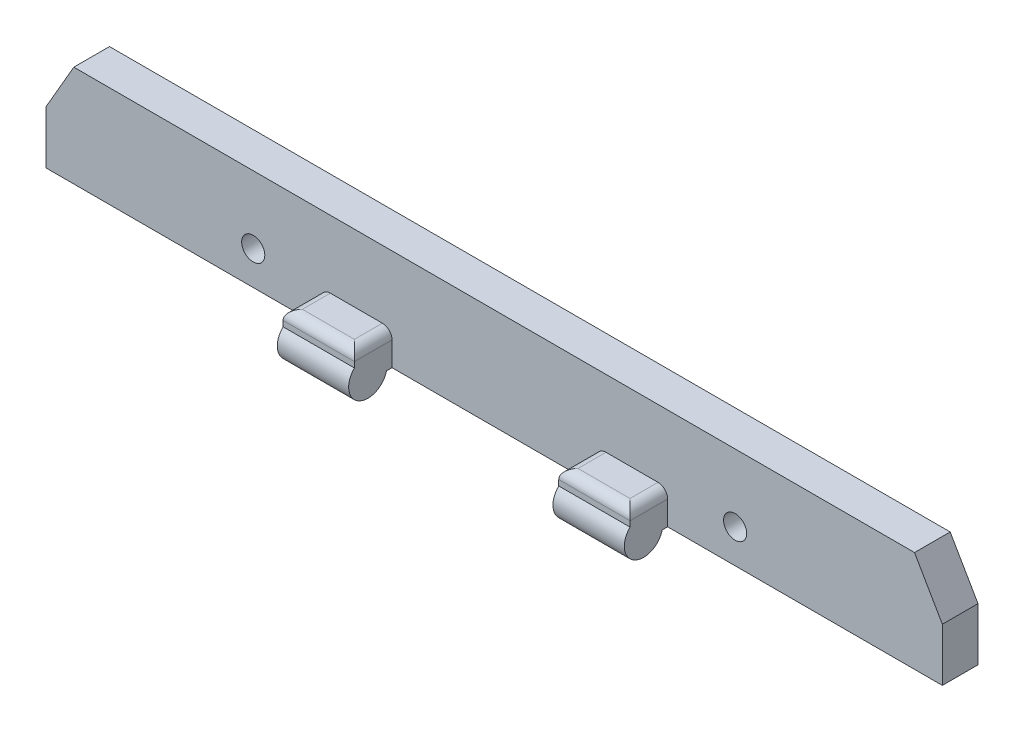
ISO-10303-21;
HEADER;
FILE_DESCRIPTION(('STEP AP214'),'2;1');
FILE_NAME('part.step','',(''),(''),'','','');
FILE_SCHEMA(('AUTOMOTIVE_DESIGN { 1 0 10303 214 1 1 1 1 }'));
ENDSEC;
DATA;
#1=APPLICATION_CONTEXT('core data for automotive mechanical design processes');
#2=APPLICATION_PROTOCOL_DEFINITION('international standard','automotive_design',2000,#1);
#3=PRODUCT_CONTEXT('',#1,'mechanical');
#4=PRODUCT('Part','Part','',(#3));
#5=PRODUCT_RELATED_PRODUCT_CATEGORY('part','',(#4));
#6=PRODUCT_DEFINITION_FORMATION('','',#4);
#7=PRODUCT_DEFINITION_CONTEXT('part definition',#1,'design');
#8=PRODUCT_DEFINITION('design','',#6,#7);
#9=PRODUCT_DEFINITION_SHAPE('','',#8);
#10=(LENGTH_UNIT() NAMED_UNIT(*) SI_UNIT(.MILLI.,.METRE.));
#11=(NAMED_UNIT(*) PLANE_ANGLE_UNIT() SI_UNIT($,.RADIAN.));
#12=(NAMED_UNIT(*) SI_UNIT($,.STERADIAN.) SOLID_ANGLE_UNIT());
#13=UNCERTAINTY_MEASURE_WITH_UNIT(LENGTH_MEASURE(1.E-05),#10,'distance_accuracy_value','');
#14=(GEOMETRIC_REPRESENTATION_CONTEXT(3) GLOBAL_UNCERTAINTY_ASSIGNED_CONTEXT((#13)) GLOBAL_UNIT_ASSIGNED_CONTEXT((#10,
#11,#12)) REPRESENTATION_CONTEXT('',''));
#15=CARTESIAN_POINT('',(0.,0.,0.));
#16=DIRECTION('',(0.,0.,1.));
#17=DIRECTION('',(1.,0.,0.));
#18=AXIS2_PLACEMENT_3D('',#15,#16,#17);
#19=CARTESIAN_POINT('',(46.5,-3.50000000000001,3.7));
#20=DIRECTION('',(0.,1.,0.));
#21=DIRECTION('',(-1.,0.,0.));
#22=AXIS2_PLACEMENT_3D('',#19,#20,#21);
#23=PLANE('',#22);
#24=DIRECTION('',(0.,0.,-1.));
#25=VECTOR('',#24,1.);
#26=CARTESIAN_POINT('',(18.,-3.49999999999999,8.7));
#27=LINE('',#26,#25);
#28=CARTESIAN_POINT('',(18.,-3.49999999999999,4.26350832689629));
#29=VERTEX_POINT('',#28);
#30=CARTESIAN_POINT('',(18.,-3.49999999999999,3.7));
#31=VERTEX_POINT('',#30);
#32=EDGE_CURVE('E252',#29,#31,#27,.T.);
#33=ORIENTED_EDGE('',*,*,#32,.F.);
#34=DIRECTION('',(1.,0.,0.));
#35=VECTOR('',#34,1.);
#36=CARTESIAN_POINT('',(6.44668806854096,-3.49999999999999,4.26350832689629));
#37=LINE('',#36,#35);
#38=CARTESIAN_POINT('',(10.6,-3.49999999999999,4.26350832689629));
#39=VERTEX_POINT('',#38);
#40=EDGE_CURVE('E177',#39,#29,#37,.T.);
#41=ORIENTED_EDGE('',*,*,#40,.F.);
#42=DIRECTION('',(0.,0.,-1.));
#43=VECTOR('',#42,1.);
#44=CARTESIAN_POINT('',(10.6,-3.49999999999999,8.7));
#45=LINE('',#44,#43);
#46=CARTESIAN_POINT('',(10.6,-3.50000000000001,3.7));
#47=VERTEX_POINT('',#46);
#48=EDGE_CURVE('E254',#39,#47,#45,.T.);
#49=ORIENTED_EDGE('',*,*,#48,.T.);
#50=DIRECTION('',(1.,0.,0.));
#51=VECTOR('',#50,1.);
#52=CARTESIAN_POINT('',(46.5,-3.50000000000001,3.7));
#53=LINE('',#52,#51);
#54=CARTESIAN_POINT('',(-10.6,-3.50000000000001,3.7));
#55=VERTEX_POINT('',#54);
#56=EDGE_CURVE('E290',#55,#47,#53,.T.);
#57=ORIENTED_EDGE('',*,*,#56,.F.);
#58=DIRECTION('',(0.,0.,-1.));
#59=VECTOR('',#58,1.);
#60=CARTESIAN_POINT('',(-10.6,-3.5,8.7));
#61=LINE('',#60,#59);
#62=CARTESIAN_POINT('',(-10.6,-3.5,4.26350832689629));
#63=VERTEX_POINT('',#62);
#64=EDGE_CURVE('E264',#63,#55,#61,.T.);
#65=ORIENTED_EDGE('',*,*,#64,.F.);
#66=DIRECTION('',(-1.,0.,0.));
#67=VECTOR('',#66,1.);
#68=CARTESIAN_POINT('',(-6.44668806854096,-3.5,4.26350832689629));
#69=LINE('',#68,#67);
#70=CARTESIAN_POINT('',(-18.,-3.5,4.26350832689629));
#71=VERTEX_POINT('',#70);
#72=EDGE_CURVE('E242',#63,#71,#69,.T.);
#73=ORIENTED_EDGE('',*,*,#72,.T.);
#74=DIRECTION('',(0.,0.,-1.));
#75=VECTOR('',#74,1.);
#76=CARTESIAN_POINT('',(-18.,-3.5,8.7));
#77=LINE('',#76,#75);
#78=CARTESIAN_POINT('',(-18.,-3.50000000000001,3.7));
#79=VERTEX_POINT('',#78);
#80=EDGE_CURVE('E266',#71,#79,#77,.T.);
#81=ORIENTED_EDGE('',*,*,#80,.T.);
#82=CARTESIAN_POINT('',(-46.5,-3.50000000000002,3.7));
#83=VERTEX_POINT('',#82);
#84=EDGE_CURVE('E286',#83,#79,#53,.T.);
#85=ORIENTED_EDGE('',*,*,#84,.F.);
#86=DIRECTION('',(0.,0.,-1.));
#87=VECTOR('',#86,1.);
#88=CARTESIAN_POINT('',(-46.5,-3.50000000000002,3.7));
#89=LINE('',#88,#87);
#90=CARTESIAN_POINT('',(-46.5,-3.50000000000002,0.));
#91=VERTEX_POINT('',#90);
#92=EDGE_CURVE('E301',#83,#91,#89,.T.);
#93=ORIENTED_EDGE('',*,*,#92,.T.);
#94=DIRECTION('',(1.,0.,0.));
#95=VECTOR('',#94,1.);
#96=CARTESIAN_POINT('',(46.5,-3.50000000000001,0.));
#97=LINE('',#96,#95);
#98=CARTESIAN_POINT('',(46.5,-3.50000000000001,0.));
#99=VERTEX_POINT('',#98);
#100=EDGE_CURVE('E295',#91,#99,#97,.T.);
#101=ORIENTED_EDGE('',*,*,#100,.T.);
#102=DIRECTION('',(0.,0.,-1.));
#103=VECTOR('',#102,1.);
#104=CARTESIAN_POINT('',(46.5,-3.50000000000001,3.7));
#105=LINE('',#104,#103);
#106=CARTESIAN_POINT('',(46.5,-3.50000000000001,3.7));
#107=VERTEX_POINT('',#106);
#108=EDGE_CURVE('E293',#107,#99,#105,.T.);
#109=ORIENTED_EDGE('',*,*,#108,.F.);
#110=EDGE_CURVE('E284',#31,#107,#53,.T.);
#111=ORIENTED_EDGE('',*,*,#110,.F.);
#112=EDGE_LOOP('',(#33,#41,#49,#57,#65,#73,#81,#85,#93,#101,#109,#111));
#113=FACE_BOUND('',#112,.T.);
#114=ADVANCED_FACE('F33',(#113),#23,.F.);
#115=CARTESIAN_POINT('',(0.,0.,3.7));
#116=DIRECTION('',(0.,0.,1.));
#117=DIRECTION('',(1.,0.,0.));
#118=AXIS2_PLACEMENT_3D('',#115,#116,#117);
#119=PLANE('',#118);
#120=DIRECTION('',(0.499999999999996,0.866025403784441,0.));
#121=VECTOR('',#120,1.);
#122=CARTESIAN_POINT('',(-46.5,1.99999999999998,3.7));
#123=LINE('',#122,#121);
#124=CARTESIAN_POINT('',(-46.5,1.99999999999998,3.7));
#125=VERTEX_POINT('',#124);
#126=CARTESIAN_POINT('',(-43.6132486540519,6.99999999999997,3.7));
#127=VERTEX_POINT('',#126);
#128=EDGE_CURVE('E224',#125,#127,#123,.T.);
#129=ORIENTED_EDGE('',*,*,#128,.F.);
#130=DIRECTION('',(0.,-1.,0.));
#131=VECTOR('',#130,1.);
#132=CARTESIAN_POINT('',(-46.5,-3.50000000000002,3.7));
#133=LINE('',#132,#131);
#134=EDGE_CURVE('E282',#125,#83,#133,.T.);
#135=ORIENTED_EDGE('',*,*,#134,.T.);
#136=ORIENTED_EDGE('',*,*,#84,.T.);
#137=DIRECTION('',(0.,-1.,0.));
#138=VECTOR('',#137,1.);
#139=CARTESIAN_POINT('',(-18.,-3.5,3.7));
#140=LINE('',#139,#138);
#141=CARTESIAN_POINT('',(-18.,-1.,3.7));
#142=VERTEX_POINT('',#141);
#143=EDGE_CURVE('E257',#142,#79,#140,.T.);
#144=ORIENTED_EDGE('',*,*,#143,.F.);
#145=CARTESIAN_POINT('',(-17.,-1.,3.7));
#146=DIRECTION('',(0.,0.,1.));
#147=DIRECTION('',(1.,0.,0.));
#148=AXIS2_PLACEMENT_3D('',#145,#146,#147);
#149=CIRCLE('',#148,1.);
#150=CARTESIAN_POINT('',(-17.,0.,3.7));
#151=VERTEX_POINT('',#150);
#152=EDGE_CURVE('E328',#142,#151,#149,.F.);
#153=ORIENTED_EDGE('',*,*,#152,.T.);
#154=DIRECTION('',(-1.,0.,0.));
#155=VECTOR('',#154,1.);
#156=CARTESIAN_POINT('',(-10.6,0.,3.7));
#157=LINE('',#156,#155);
#158=CARTESIAN_POINT('',(-11.6,0.,3.7));
#159=VERTEX_POINT('',#158);
#160=EDGE_CURVE('E261',#159,#151,#157,.T.);
#161=ORIENTED_EDGE('',*,*,#160,.F.);
#162=CARTESIAN_POINT('',(-11.6,-1.,3.7));
#163=DIRECTION('',(0.,0.,1.));
#164=DIRECTION('',(1.,0.,0.));
#165=AXIS2_PLACEMENT_3D('',#162,#163,#164);
#166=CIRCLE('',#165,1.);
#167=CARTESIAN_POINT('',(-10.6,-1.,3.7));
#168=VERTEX_POINT('',#167);
#169=EDGE_CURVE('E11',#159,#168,#166,.F.);
#170=ORIENTED_EDGE('',*,*,#169,.T.);
#171=DIRECTION('',(0.,1.,0.));
#172=VECTOR('',#171,1.);
#173=CARTESIAN_POINT('',(-10.6,-3.5,3.7));
#174=LINE('',#173,#172);
#175=EDGE_CURVE('E259',#55,#168,#174,.T.);
#176=ORIENTED_EDGE('',*,*,#175,.F.);
#177=ORIENTED_EDGE('',*,*,#56,.T.);
#178=DIRECTION('',(0.,-1.,0.));
#179=VECTOR('',#178,1.);
#180=CARTESIAN_POINT('',(10.6,-3.49999999999999,3.7));
#181=LINE('',#180,#179);
#182=CARTESIAN_POINT('',(10.6,-1.,3.7));
#183=VERTEX_POINT('',#182);
#184=EDGE_CURVE('E241',#183,#47,#181,.T.);
#185=ORIENTED_EDGE('',*,*,#184,.F.);
#186=CARTESIAN_POINT('',(11.6,-1.,3.7));
#187=DIRECTION('',(0.,0.,1.));
#188=DIRECTION('',(1.,0.,0.));
#189=AXIS2_PLACEMENT_3D('',#186,#187,#188);
#190=CIRCLE('',#189,1.);
#191=CARTESIAN_POINT('',(11.6,0.,3.7));
#192=VERTEX_POINT('',#191);
#193=EDGE_CURVE('E330',#183,#192,#190,.F.);
#194=ORIENTED_EDGE('',*,*,#193,.T.);
#195=DIRECTION('',(-1.,0.,0.));
#196=VECTOR('',#195,1.);
#197=CARTESIAN_POINT('',(18.,0.,3.7));
#198=LINE('',#197,#196);
#199=CARTESIAN_POINT('',(17.,0.,3.7));
#200=VERTEX_POINT('',#199);
#201=EDGE_CURVE('E249',#200,#192,#198,.T.);
#202=ORIENTED_EDGE('',*,*,#201,.F.);
#203=CARTESIAN_POINT('',(17.,-1.,3.7));
#204=DIRECTION('',(0.,0.,1.));
#205=DIRECTION('',(1.,0.,0.));
#206=AXIS2_PLACEMENT_3D('',#203,#204,#205);
#207=CIRCLE('',#206,1.);
#208=CARTESIAN_POINT('',(18.,-1.,3.7));
#209=VERTEX_POINT('',#208);
#210=EDGE_CURVE('E42',#200,#209,#207,.F.);
#211=ORIENTED_EDGE('',*,*,#210,.T.);
#212=DIRECTION('',(0.,1.,0.));
#213=VECTOR('',#212,1.);
#214=CARTESIAN_POINT('',(18.,-3.49999999999999,3.7));
#215=LINE('',#214,#213);
#216=EDGE_CURVE('E247',#31,#209,#215,.T.);
#217=ORIENTED_EDGE('',*,*,#216,.F.);
#218=ORIENTED_EDGE('',*,*,#110,.T.);
#219=DIRECTION('',(0.,1.,0.));
#220=VECTOR('',#219,1.);
#221=CARTESIAN_POINT('',(46.5,-3.50000000000001,3.7));
#222=LINE('',#221,#220);
#223=CARTESIAN_POINT('',(46.5,2.00000000000054,3.7));
#224=VERTEX_POINT('',#223);
#225=EDGE_CURVE('E289',#107,#224,#222,.T.);
#226=ORIENTED_EDGE('',*,*,#225,.T.);
#227=DIRECTION('',(0.500000000000116,-0.866025403784372,0.));
#228=VECTOR('',#227,1.);
#229=CARTESIAN_POINT('',(46.5,2.00000000000054,3.7));
#230=LINE('',#229,#228);
#231=CARTESIAN_POINT('',(43.6132486540519,6.99999999999998,3.7));
#232=VERTEX_POINT('',#231);
#233=EDGE_CURVE('E213',#232,#224,#230,.T.);
#234=ORIENTED_EDGE('',*,*,#233,.F.);
#235=DIRECTION('',(-1.,0.,0.));
#236=VECTOR('',#235,1.);
#237=CARTESIAN_POINT('',(43.6132486540519,6.99999999999998,3.7));
#238=LINE('',#237,#236);
#239=EDGE_CURVE('E209',#232,#127,#238,.T.);
#240=ORIENTED_EDGE('',*,*,#239,.T.);
#241=EDGE_LOOP('',(#129,#135,#136,#144,#153,#161,#170,#176,#177,#185,#194,#202,#211,#217,#218,
#226,#234,#240));
#242=FACE_BOUND('',#241,.T.);
#243=CARTESIAN_POINT('',(-25.,0.,3.7));
#244=DIRECTION('',(0.,0.,1.));
#245=DIRECTION('',(1.,0.,0.));
#246=AXIS2_PLACEMENT_3D('',#243,#244,#245);
#247=CIRCLE('',#246,1.2);
#248=CARTESIAN_POINT('',(-23.8,0.,3.7));
#249=VERTEX_POINT('',#248);
#250=EDGE_CURVE('E276',#249,#249,#247,.T.);
#251=ORIENTED_EDGE('',*,*,#250,.F.);
#252=EDGE_LOOP('',(#251));
#253=FACE_BOUND('',#252,.T.);
#254=CARTESIAN_POINT('',(25.,0.,3.7));
#255=DIRECTION('',(0.,0.,1.));
#256=DIRECTION('',(1.,0.,0.));
#257=AXIS2_PLACEMENT_3D('',#254,#255,#256);
#258=CIRCLE('',#257,1.2);
#259=CARTESIAN_POINT('',(26.2,0.,3.7));
#260=VERTEX_POINT('',#259);
#261=EDGE_CURVE('E270',#260,#260,#258,.T.);
#262=ORIENTED_EDGE('',*,*,#261,.F.);
#263=EDGE_LOOP('',(#262));
#264=FACE_BOUND('',#263,.T.);
#265=ADVANCED_FACE('F352',(#242,#253,#264),#119,.T.);
#266=CARTESIAN_POINT('',(0.,0.,0.));
#267=DIRECTION('',(0.,0.,1.));
#268=DIRECTION('',(1.,0.,0.));
#269=AXIS2_PLACEMENT_3D('',#266,#267,#268);
#270=PLANE('',#269);
#271=DIRECTION('',(0.,-1.,0.));
#272=VECTOR('',#271,1.);
#273=CARTESIAN_POINT('',(-46.5,-3.50000000000002,0.));
#274=LINE('',#273,#272);
#275=CARTESIAN_POINT('',(-46.5,1.99999999999998,0.));
#276=VERTEX_POINT('',#275);
#277=EDGE_CURVE('E279',#276,#91,#274,.T.);
#278=ORIENTED_EDGE('',*,*,#277,.F.);
#279=DIRECTION('',(0.499999999999996,0.866025403784441,0.));
#280=VECTOR('',#279,1.);
#281=CARTESIAN_POINT('',(-46.5,1.99999999999998,0.));
#282=LINE('',#281,#280);
#283=CARTESIAN_POINT('',(-43.6132486540519,6.99999999999997,0.));
#284=VERTEX_POINT('',#283);
#285=EDGE_CURVE('E222',#276,#284,#282,.T.);
#286=ORIENTED_EDGE('',*,*,#285,.T.);
#287=DIRECTION('',(1.,0.,0.));
#288=VECTOR('',#287,1.);
#289=CARTESIAN_POINT('',(43.6132486540519,6.99999999999998,0.));
#290=LINE('',#289,#288);
#291=CARTESIAN_POINT('',(43.6132486540519,6.99999999999998,0.));
#292=VERTEX_POINT('',#291);
#293=EDGE_CURVE('E210',#284,#292,#290,.T.);
#294=ORIENTED_EDGE('',*,*,#293,.T.);
#295=DIRECTION('',(0.500000000000116,-0.866025403784372,0.));
#296=VECTOR('',#295,1.);
#297=CARTESIAN_POINT('',(46.5,2.00000000000054,0.));
#298=LINE('',#297,#296);
#299=CARTESIAN_POINT('',(46.5,2.00000000000054,0.));
#300=VERTEX_POINT('',#299);
#301=EDGE_CURVE('E228',#292,#300,#298,.T.);
#302=ORIENTED_EDGE('',*,*,#301,.T.);
#303=DIRECTION('',(0.,1.,0.));
#304=VECTOR('',#303,1.);
#305=CARTESIAN_POINT('',(46.5,-3.50000000000001,0.));
#306=LINE('',#305,#304);
#307=EDGE_CURVE('E285',#99,#300,#306,.T.);
#308=ORIENTED_EDGE('',*,*,#307,.F.);
#309=ORIENTED_EDGE('',*,*,#100,.F.);
#310=EDGE_LOOP('',(#278,#286,#294,#302,#308,#309));
#311=FACE_BOUND('',#310,.T.);
#312=CARTESIAN_POINT('',(-25.,0.,0.));
#313=DIRECTION('',(0.,0.,1.));
#314=DIRECTION('',(1.,0.,0.));
#315=AXIS2_PLACEMENT_3D('',#312,#313,#314);
#316=CIRCLE('',#315,1.2);
#317=CARTESIAN_POINT('',(-23.8,0.,0.));
#318=VERTEX_POINT('',#317);
#319=EDGE_CURVE('E273',#318,#318,#316,.T.);
#320=ORIENTED_EDGE('',*,*,#319,.T.);
#321=EDGE_LOOP('',(#320));
#322=FACE_BOUND('',#321,.T.);
#323=CARTESIAN_POINT('',(25.,0.,0.));
#324=DIRECTION('',(0.,0.,1.));
#325=DIRECTION('',(1.,0.,0.));
#326=AXIS2_PLACEMENT_3D('',#323,#324,#325);
#327=CIRCLE('',#326,1.2);
#328=CARTESIAN_POINT('',(26.2,0.,0.));
#329=VERTEX_POINT('',#328);
#330=EDGE_CURVE('E269',#329,#329,#327,.T.);
#331=ORIENTED_EDGE('',*,*,#330,.T.);
#332=EDGE_LOOP('',(#331));
#333=FACE_BOUND('',#332,.T.);
#334=ADVANCED_FACE('F374',(#311,#322,#333),#270,.F.);
#335=CARTESIAN_POINT('',(-46.5,-3.50000000000002,3.7));
#336=DIRECTION('',(1.,0.,0.));
#337=DIRECTION('',(0.,0.,-1.));
#338=AXIS2_PLACEMENT_3D('',#335,#336,#337);
#339=PLANE('',#338);
#340=ORIENTED_EDGE('',*,*,#134,.F.);
#341=DIRECTION('',(0.,0.,1.));
#342=VECTOR('',#341,1.);
#343=CARTESIAN_POINT('',(-46.5,1.99999999999998,0.));
#344=LINE('',#343,#342);
#345=EDGE_CURVE('E181',#276,#125,#344,.T.);
#346=ORIENTED_EDGE('',*,*,#345,.F.);
#347=ORIENTED_EDGE('',*,*,#277,.T.);
#348=ORIENTED_EDGE('',*,*,#92,.F.);
#349=EDGE_LOOP('',(#340,#346,#347,#348));
#350=FACE_BOUND('',#349,.T.);
#351=ADVANCED_FACE('F388',(#350),#339,.F.);
#352=CARTESIAN_POINT('',(46.5,-3.50000000000001,3.7));
#353=DIRECTION('',(-1.,0.,0.));
#354=DIRECTION('',(0.,0.,1.));
#355=AXIS2_PLACEMENT_3D('',#352,#353,#354);
#356=PLANE('',#355);
#357=ORIENTED_EDGE('',*,*,#307,.T.);
#358=DIRECTION('',(0.,0.,1.));
#359=VECTOR('',#358,1.);
#360=CARTESIAN_POINT('',(46.5,2.00000000000054,0.));
#361=LINE('',#360,#359);
#362=EDGE_CURVE('E226',#300,#224,#361,.T.);
#363=ORIENTED_EDGE('',*,*,#362,.T.);
#364=ORIENTED_EDGE('',*,*,#225,.F.);
#365=ORIENTED_EDGE('',*,*,#108,.T.);
#366=EDGE_LOOP('',(#357,#363,#364,#365));
#367=FACE_BOUND('',#366,.T.);
#368=ADVANCED_FACE('F369',(#367),#356,.F.);
#369=CARTESIAN_POINT('',(-25.,0.,3.7));
#370=DIRECTION('',(0.,0.,-1.));
#371=DIRECTION('',(-1.,0.,0.));
#372=AXIS2_PLACEMENT_3D('',#369,#370,#371);
#373=CYLINDRICAL_SURFACE('',#372,1.2);
#374=ORIENTED_EDGE('',*,*,#250,.T.);
#375=EDGE_LOOP('',(#374));
#376=FACE_BOUND('',#375,.T.);
#377=ORIENTED_EDGE('',*,*,#319,.F.);
#378=EDGE_LOOP('',(#377));
#379=FACE_BOUND('',#378,.T.);
#380=ADVANCED_FACE('F606',(#376,#379),#373,.F.);
#381=CARTESIAN_POINT('',(25.,0.,3.7));
#382=DIRECTION('',(0.,0.,-1.));
#383=DIRECTION('',(-1.,0.,0.));
#384=AXIS2_PLACEMENT_3D('',#381,#382,#383);
#385=CYLINDRICAL_SURFACE('',#384,1.2);
#386=ORIENTED_EDGE('',*,*,#261,.T.);
#387=EDGE_LOOP('',(#386));
#388=FACE_BOUND('',#387,.T.);
#389=ORIENTED_EDGE('',*,*,#330,.F.);
#390=EDGE_LOOP('',(#389));
#391=FACE_BOUND('',#390,.T.);
#392=ADVANCED_FACE('F538',(#388,#391),#385,.F.);
#393=CARTESIAN_POINT('',(-18.,-3.5,8.7));
#394=DIRECTION('',(1.,0.,0.));
#395=DIRECTION('',(0.,0.,-1.));
#396=AXIS2_PLACEMENT_3D('',#393,#394,#395);
#397=PLANE('',#396);
#398=DIRECTION('',(0.,1.,0.));
#399=VECTOR('',#398,1.);
#400=CARTESIAN_POINT('',(-18.,-3.5,7.60125853844408));
#401=LINE('',#400,#399);
#402=CARTESIAN_POINT('',(-18.,-1.57294901687515,7.60125853844408));
#403=VERTEX_POINT('',#402);
#404=CARTESIAN_POINT('',(-18.,-1.,7.60125853844408));
#405=VERTEX_POINT('',#404);
#406=EDGE_CURVE('E206',#403,#405,#401,.T.);
#407=ORIENTED_EDGE('',*,*,#406,.T.);
#408=DIRECTION('',(0.,0.,-1.));
#409=VECTOR('',#408,1.);
#410=CARTESIAN_POINT('',(-18.,-1.,8.7));
#411=LINE('',#410,#409);
#412=EDGE_CURVE('E304',#405,#142,#411,.T.);
#413=ORIENTED_EDGE('',*,*,#412,.T.);
#414=ORIENTED_EDGE('',*,*,#143,.T.);
#415=ORIENTED_EDGE('',*,*,#80,.F.);
#416=CARTESIAN_POINT('',(-18.,-3.,6.2));
#417=DIRECTION('',(-1.,0.,0.));
#418=DIRECTION('',(0.,0.,1.));
#419=AXIS2_PLACEMENT_3D('',#416,#417,#418);
#420=CIRCLE('',#419,2.);
#421=EDGE_CURVE('E235',#71,#403,#420,.T.);
#422=ORIENTED_EDGE('',*,*,#421,.T.);
#423=EDGE_LOOP('',(#407,#413,#414,#415,#422));
#424=FACE_BOUND('',#423,.T.);
#425=ADVANCED_FACE('F392',(#424),#397,.F.);
#426=CARTESIAN_POINT('',(-10.6,-3.5,8.7));
#427=DIRECTION('',(-1.,0.,0.));
#428=DIRECTION('',(0.,0.,1.));
#429=AXIS2_PLACEMENT_3D('',#426,#427,#428);
#430=PLANE('',#429);
#431=ORIENTED_EDGE('',*,*,#175,.T.);
#432=DIRECTION('',(0.,0.,-1.));
#433=VECTOR('',#432,1.);
#434=CARTESIAN_POINT('',(-10.6,-1.,8.7));
#435=LINE('',#434,#433);
#436=CARTESIAN_POINT('',(-10.6,-1.,7.60125853844408));
#437=VERTEX_POINT('',#436);
#438=EDGE_CURVE('E55',#168,#437,#435,.F.);
#439=ORIENTED_EDGE('',*,*,#438,.T.);
#440=DIRECTION('',(0.,-1.,0.));
#441=VECTOR('',#440,1.);
#442=CARTESIAN_POINT('',(-10.6,-3.5,7.60125853844408));
#443=LINE('',#442,#441);
#444=CARTESIAN_POINT('',(-10.6,-1.57294901687515,7.60125853844408));
#445=VERTEX_POINT('',#444);
#446=EDGE_CURVE('E204',#437,#445,#443,.T.);
#447=ORIENTED_EDGE('',*,*,#446,.T.);
#448=CARTESIAN_POINT('',(-10.6,-3.,6.2));
#449=DIRECTION('',(-1.,0.,0.));
#450=DIRECTION('',(0.,0.,1.));
#451=AXIS2_PLACEMENT_3D('',#448,#449,#450);
#452=CIRCLE('',#451,2.);
#453=EDGE_CURVE('E238',#445,#63,#452,.F.);
#454=ORIENTED_EDGE('',*,*,#453,.T.);
#455=ORIENTED_EDGE('',*,*,#64,.T.);
#456=EDGE_LOOP('',(#431,#439,#447,#454,#455));
#457=FACE_BOUND('',#456,.T.);
#458=ADVANCED_FACE('F520',(#457),#430,.F.);
#459=CARTESIAN_POINT('',(-10.6,0.,8.7));
#460=DIRECTION('',(0.,-1.,0.));
#461=DIRECTION('',(1.,0.,0.));
#462=AXIS2_PLACEMENT_3D('',#459,#460,#461);
#463=PLANE('',#462);
#464=ORIENTED_EDGE('',*,*,#160,.T.);
#465=DIRECTION('',(0.,0.,-1.));
#466=VECTOR('',#465,1.);
#467=CARTESIAN_POINT('',(-17.,0.,8.7));
#468=LINE('',#467,#466);
#469=CARTESIAN_POINT('',(-17.,0.,6.60125853844408));
#470=VERTEX_POINT('',#469);
#471=EDGE_CURVE('E311',#151,#470,#468,.F.);
#472=ORIENTED_EDGE('',*,*,#471,.T.);
#473=DIRECTION('',(1.,0.,0.));
#474=VECTOR('',#473,1.);
#475=CARTESIAN_POINT('',(-10.6,0.,6.60125853844408));
#476=LINE('',#475,#474);
#477=CARTESIAN_POINT('',(-11.6,0.,6.60125853844408));
#478=VERTEX_POINT('',#477);
#479=EDGE_CURVE('E307',#470,#478,#476,.T.);
#480=ORIENTED_EDGE('',*,*,#479,.T.);
#481=DIRECTION('',(0.,0.,-1.));
#482=VECTOR('',#481,1.);
#483=CARTESIAN_POINT('',(-11.6,0.,8.7));
#484=LINE('',#483,#482);
#485=EDGE_CURVE('E309',#478,#159,#484,.T.);
#486=ORIENTED_EDGE('',*,*,#485,.T.);
#487=EDGE_LOOP('',(#464,#472,#480,#486));
#488=FACE_BOUND('',#487,.T.);
#489=ADVANCED_FACE('F401',(#488),#463,.F.);
#490=CARTESIAN_POINT('',(10.6,-3.49999999999999,8.7));
#491=DIRECTION('',(1.,0.,0.));
#492=DIRECTION('',(0.,0.,-1.));
#493=AXIS2_PLACEMENT_3D('',#490,#491,#492);
#494=PLANE('',#493);
#495=DIRECTION('',(0.,1.,0.));
#496=VECTOR('',#495,1.);
#497=CARTESIAN_POINT('',(10.6,-3.49999999999999,7.60125853844408));
#498=LINE('',#497,#496);
#499=CARTESIAN_POINT('',(10.6,-1.57294901687515,7.60125853844408));
#500=VERTEX_POINT('',#499);
#501=CARTESIAN_POINT('',(10.6,-1.,7.60125853844408));
#502=VERTEX_POINT('',#501);
#503=EDGE_CURVE('E190',#500,#502,#498,.T.);
#504=ORIENTED_EDGE('',*,*,#503,.T.);
#505=DIRECTION('',(0.,0.,-1.));
#506=VECTOR('',#505,1.);
#507=CARTESIAN_POINT('',(10.6,-1.,8.7));
#508=LINE('',#507,#506);
#509=EDGE_CURVE('E313',#502,#183,#508,.T.);
#510=ORIENTED_EDGE('',*,*,#509,.T.);
#511=ORIENTED_EDGE('',*,*,#184,.T.);
#512=ORIENTED_EDGE('',*,*,#48,.F.);
#513=CARTESIAN_POINT('',(10.6,-2.99999999999999,6.2));
#514=DIRECTION('',(1.,0.,0.));
#515=DIRECTION('',(0.,0.,-1.));
#516=AXIS2_PLACEMENT_3D('',#513,#514,#515);
#517=CIRCLE('',#516,2.);
#518=EDGE_CURVE('E234',#39,#500,#517,.F.);
#519=ORIENTED_EDGE('',*,*,#518,.T.);
#520=EDGE_LOOP('',(#504,#510,#511,#512,#519));
#521=FACE_BOUND('',#520,.T.);
#522=ADVANCED_FACE('F359',(#521),#494,.F.);
#523=CARTESIAN_POINT('',(18.,-3.49999999999999,8.7));
#524=DIRECTION('',(-1.,0.,0.));
#525=DIRECTION('',(0.,0.,1.));
#526=AXIS2_PLACEMENT_3D('',#523,#524,#525);
#527=PLANE('',#526);
#528=ORIENTED_EDGE('',*,*,#216,.T.);
#529=DIRECTION('',(0.,0.,-1.));
#530=VECTOR('',#529,1.);
#531=CARTESIAN_POINT('',(18.,-1.,8.7));
#532=LINE('',#531,#530);
#533=CARTESIAN_POINT('',(18.,-1.,7.60125853844408));
#534=VERTEX_POINT('',#533);
#535=EDGE_CURVE('E196',#209,#534,#532,.F.);
#536=ORIENTED_EDGE('',*,*,#535,.T.);
#537=DIRECTION('',(0.,1.,0.));
#538=VECTOR('',#537,1.);
#539=CARTESIAN_POINT('',(18.,-1.57294901687515,7.60125853844408));
#540=LINE('',#539,#538);
#541=CARTESIAN_POINT('',(18.,-1.57294901687515,7.60125853844408));
#542=VERTEX_POINT('',#541);
#543=EDGE_CURVE('E187',#542,#534,#540,.T.);
#544=ORIENTED_EDGE('',*,*,#543,.F.);
#545=CARTESIAN_POINT('',(18.,-2.99999999999999,6.2));
#546=DIRECTION('',(1.,0.,0.));
#547=DIRECTION('',(0.,0.,-1.));
#548=AXIS2_PLACEMENT_3D('',#545,#546,#547);
#549=CIRCLE('',#548,2.);
#550=EDGE_CURVE('E172',#542,#29,#549,.T.);
#551=ORIENTED_EDGE('',*,*,#550,.T.);
#552=ORIENTED_EDGE('',*,*,#32,.T.);
#553=EDGE_LOOP('',(#528,#536,#544,#551,#552));
#554=FACE_BOUND('',#553,.T.);
#555=ADVANCED_FACE('F194',(#554),#527,.F.);
#556=CARTESIAN_POINT('',(18.,0.,8.7));
#557=DIRECTION('',(0.,-1.,0.));
#558=DIRECTION('',(1.,0.,0.));
#559=AXIS2_PLACEMENT_3D('',#556,#557,#558);
#560=PLANE('',#559);
#561=ORIENTED_EDGE('',*,*,#201,.T.);
#562=DIRECTION('',(0.,0.,-1.));
#563=VECTOR('',#562,1.);
#564=CARTESIAN_POINT('',(11.6,0.,8.7));
#565=LINE('',#564,#563);
#566=CARTESIAN_POINT('',(11.6,0.,6.60125853844408));
#567=VERTEX_POINT('',#566);
#568=EDGE_CURVE('E320',#192,#567,#565,.F.);
#569=ORIENTED_EDGE('',*,*,#568,.T.);
#570=DIRECTION('',(1.,0.,0.));
#571=VECTOR('',#570,1.);
#572=CARTESIAN_POINT('',(18.,0.,6.60125853844408));
#573=LINE('',#572,#571);
#574=CARTESIAN_POINT('',(17.,0.,6.60125853844408));
#575=VERTEX_POINT('',#574);
#576=EDGE_CURVE('E316',#567,#575,#573,.T.);
#577=ORIENTED_EDGE('',*,*,#576,.T.);
#578=DIRECTION('',(0.,0.,-1.));
#579=VECTOR('',#578,1.);
#580=CARTESIAN_POINT('',(17.,0.,8.7));
#581=LINE('',#580,#579);
#582=EDGE_CURVE('E318',#575,#200,#581,.T.);
#583=ORIENTED_EDGE('',*,*,#582,.T.);
#584=EDGE_LOOP('',(#561,#569,#577,#583));
#585=FACE_BOUND('',#584,.T.);
#586=ADVANCED_FACE('F350',(#585),#560,.F.);
#587=CARTESIAN_POINT('',(-6.44668806854096,-3.,6.2));
#588=DIRECTION('',(-1.,0.,0.));
#589=DIRECTION('',(0.,0.,1.));
#590=AXIS2_PLACEMENT_3D('',#587,#588,#589);
#591=CYLINDRICAL_SURFACE('',#590,2.);
#592=ORIENTED_EDGE('',*,*,#453,.F.);
#593=DIRECTION('',(1.,0.,0.));
#594=VECTOR('',#593,1.);
#595=CARTESIAN_POINT('',(-46.5,-1.57294901687515,7.60125853844408));
#596=LINE('',#595,#594);
#597=EDGE_CURVE('E191',#403,#445,#596,.T.);
#598=ORIENTED_EDGE('',*,*,#597,.F.);
#599=ORIENTED_EDGE('',*,*,#421,.F.);
#600=ORIENTED_EDGE('',*,*,#72,.F.);
#601=EDGE_LOOP('',(#592,#598,#599,#600));
#602=FACE_BOUND('',#601,.T.);
#603=ADVANCED_FACE('F489',(#602),#591,.T.);
#604=CARTESIAN_POINT('',(6.44668806854096,-2.99999999999999,6.2));
#605=DIRECTION('',(1.,0.,0.));
#606=DIRECTION('',(0.,0.,-1.));
#607=AXIS2_PLACEMENT_3D('',#604,#605,#606);
#608=CYLINDRICAL_SURFACE('',#607,2.);
#609=ORIENTED_EDGE('',*,*,#518,.F.);
#610=ORIENTED_EDGE('',*,*,#40,.T.);
#611=ORIENTED_EDGE('',*,*,#550,.F.);
#612=EDGE_CURVE('E175',#500,#542,#596,.T.);
#613=ORIENTED_EDGE('',*,*,#612,.F.);
#614=EDGE_LOOP('',(#609,#610,#611,#613));
#615=FACE_BOUND('',#614,.T.);
#616=ADVANCED_FACE('F174',(#615),#608,.T.);
#617=CARTESIAN_POINT('',(46.5,2.00000000000054,0.));
#618=DIRECTION('',(-0.866025403784372,-0.500000000000116,0.));
#619=DIRECTION('',(0.500000000000116,-0.866025403784372,0.));
#620=AXIS2_PLACEMENT_3D('',#617,#618,#619);
#621=PLANE('',#620);
#622=ORIENTED_EDGE('',*,*,#233,.T.);
#623=ORIENTED_EDGE('',*,*,#362,.F.);
#624=ORIENTED_EDGE('',*,*,#301,.F.);
#625=DIRECTION('',(0.,0.,1.));
#626=VECTOR('',#625,1.);
#627=CARTESIAN_POINT('',(43.6132486540519,6.99999999999998,-91.3350346241365));
#628=LINE('',#627,#626);
#629=EDGE_CURVE('E217',#292,#232,#628,.T.);
#630=ORIENTED_EDGE('',*,*,#629,.T.);
#631=EDGE_LOOP('',(#622,#623,#624,#630));
#632=FACE_BOUND('',#631,.T.);
#633=ADVANCED_FACE('F371',(#632),#621,.F.);
#634=CARTESIAN_POINT('',(-46.5,1.99999999999998,0.));
#635=DIRECTION('',(0.866025403784441,-0.499999999999996,0.));
#636=DIRECTION('',(0.499999999999996,0.866025403784441,0.));
#637=AXIS2_PLACEMENT_3D('',#634,#635,#636);
#638=PLANE('',#637);
#639=ORIENTED_EDGE('',*,*,#128,.T.);
#640=DIRECTION('',(0.,0.,1.));
#641=VECTOR('',#640,1.);
#642=CARTESIAN_POINT('',(-43.6132486540519,6.99999999999997,-91.3350346241365));
#643=LINE('',#642,#641);
#644=EDGE_CURVE('E214',#284,#127,#643,.T.);
#645=ORIENTED_EDGE('',*,*,#644,.F.);
#646=ORIENTED_EDGE('',*,*,#285,.F.);
#647=ORIENTED_EDGE('',*,*,#345,.T.);
#648=EDGE_LOOP('',(#639,#645,#646,#647));
#649=FACE_BOUND('',#648,.T.);
#650=ADVANCED_FACE('F575',(#649),#638,.F.);
#651=CARTESIAN_POINT('',(43.6132486540519,6.99999999999998,-91.3350346241365));
#652=DIRECTION('',(0.,1.,0.));
#653=DIRECTION('',(-1.,0.,0.));
#654=AXIS2_PLACEMENT_3D('',#651,#652,#653);
#655=PLANE('',#654);
#656=ORIENTED_EDGE('',*,*,#293,.F.);
#657=ORIENTED_EDGE('',*,*,#644,.T.);
#658=ORIENTED_EDGE('',*,*,#239,.F.);
#659=ORIENTED_EDGE('',*,*,#629,.F.);
#660=EDGE_LOOP('',(#656,#657,#658,#659));
#661=FACE_BOUND('',#660,.T.);
#662=ADVANCED_FACE('F381',(#661),#655,.T.);
#663=CARTESIAN_POINT('',(-46.5,-1.57294901687515,7.60125853844408));
#664=DIRECTION('',(0.,0.,-1.));
#665=DIRECTION('',(-1.,0.,0.));
#666=AXIS2_PLACEMENT_3D('',#663,#664,#665);
#667=PLANE('',#666);
#668=ORIENTED_EDGE('',*,*,#543,.T.);
#669=DIRECTION('',(1.,0.,0.));
#670=VECTOR('',#669,1.);
#671=CARTESIAN_POINT('',(-46.5,-1.00000000000001,7.60125853844408));
#672=LINE('',#671,#670);
#673=EDGE_CURVE('E326',#534,#502,#672,.F.);
#674=ORIENTED_EDGE('',*,*,#673,.T.);
#675=ORIENTED_EDGE('',*,*,#503,.F.);
#676=ORIENTED_EDGE('',*,*,#612,.T.);
#677=EDGE_LOOP('',(#668,#674,#675,#676));
#678=FACE_BOUND('',#677,.T.);
#679=ADVANCED_FACE('F186',(#678),#667,.F.);
#680=ORIENTED_EDGE('',*,*,#446,.F.);
#681=DIRECTION('',(1.,0.,0.));
#682=VECTOR('',#681,1.);
#683=CARTESIAN_POINT('',(-46.5,-1.,7.60125853844408));
#684=LINE('',#683,#682);
#685=EDGE_CURVE('E324',#437,#405,#684,.F.);
#686=ORIENTED_EDGE('',*,*,#685,.T.);
#687=ORIENTED_EDGE('',*,*,#406,.F.);
#688=ORIENTED_EDGE('',*,*,#597,.T.);
#689=EDGE_LOOP('',(#680,#686,#687,#688));
#690=FACE_BOUND('',#689,.T.);
#691=ADVANCED_FACE('F410',(#690),#667,.F.);
#692=CARTESIAN_POINT('',(-11.6,-1.,8.7));
#693=DIRECTION('',(0.,0.,-1.));
#694=DIRECTION('',(-1.,0.,0.));
#695=AXIS2_PLACEMENT_3D('',#692,#693,#694);
#696=CYLINDRICAL_SURFACE('',#695,1.);
#697=ORIENTED_EDGE('',*,*,#169,.F.);
#698=ORIENTED_EDGE('',*,*,#485,.F.);
#699=CARTESIAN_POINT('',(-11.6,-1.,6.60125853844408));
#700=DIRECTION('',(0.707106781186547,0.,-0.707106781186547));
#701=DIRECTION('',(0.707106781186547,0.,0.707106781186547));
#702=AXIS2_PLACEMENT_3D('',#699,#700,#701);
#703=ELLIPSE('',#702,1.41421356237309,1.);
#704=EDGE_CURVE('E197',#437,#478,#703,.F.);
#705=ORIENTED_EDGE('',*,*,#704,.F.);
#706=ORIENTED_EDGE('',*,*,#438,.F.);
#707=EDGE_LOOP('',(#697,#698,#705,#706));
#708=FACE_BOUND('',#707,.T.);
#709=ADVANCED_FACE('F408',(#708),#696,.T.);
#710=CARTESIAN_POINT('',(-10.6,-1.,6.60125853844408));
#711=DIRECTION('',(1.,0.,0.));
#712=DIRECTION('',(0.,1.,0.));
#713=AXIS2_PLACEMENT_3D('',#710,#711,#712);
#714=CYLINDRICAL_SURFACE('',#713,1.);
#715=ORIENTED_EDGE('',*,*,#704,.T.);
#716=ORIENTED_EDGE('',*,*,#479,.F.);
#717=CARTESIAN_POINT('',(-17.,-1.,6.60125853844408));
#718=DIRECTION('',(0.707106781186547,0.,0.707106781186547));
#719=DIRECTION('',(0.707106781186547,0.,-0.707106781186547));
#720=AXIS2_PLACEMENT_3D('',#717,#718,#719);
#721=ELLIPSE('',#720,1.41421356237309,1.);
#722=EDGE_CURVE('E200',#405,#470,#721,.F.);
#723=ORIENTED_EDGE('',*,*,#722,.F.);
#724=ORIENTED_EDGE('',*,*,#685,.F.);
#725=EDGE_LOOP('',(#715,#716,#723,#724));
#726=FACE_BOUND('',#725,.T.);
#727=ADVANCED_FACE('F404',(#726),#714,.T.);
#728=CARTESIAN_POINT('',(-17.,-1.,8.7));
#729=DIRECTION('',(0.,0.,-1.));
#730=DIRECTION('',(-1.,0.,0.));
#731=AXIS2_PLACEMENT_3D('',#728,#729,#730);
#732=CYLINDRICAL_SURFACE('',#731,1.);
#733=ORIENTED_EDGE('',*,*,#722,.T.);
#734=ORIENTED_EDGE('',*,*,#471,.F.);
#735=ORIENTED_EDGE('',*,*,#152,.F.);
#736=ORIENTED_EDGE('',*,*,#412,.F.);
#737=EDGE_LOOP('',(#733,#734,#735,#736));
#738=FACE_BOUND('',#737,.T.);
#739=ADVANCED_FACE('F397',(#738),#732,.T.);
#740=CARTESIAN_POINT('',(17.,-1.,8.7));
#741=DIRECTION('',(0.,0.,-1.));
#742=DIRECTION('',(-1.,0.,0.));
#743=AXIS2_PLACEMENT_3D('',#740,#741,#742);
#744=CYLINDRICAL_SURFACE('',#743,1.);
#745=ORIENTED_EDGE('',*,*,#210,.F.);
#746=ORIENTED_EDGE('',*,*,#582,.F.);
#747=CARTESIAN_POINT('',(17.,-1.,6.60125853844408));
#748=DIRECTION('',(0.707106781186547,0.,-0.707106781186547));
#749=DIRECTION('',(0.707106781186547,0.,0.707106781186547));
#750=AXIS2_PLACEMENT_3D('',#747,#748,#749);
#751=ELLIPSE('',#750,1.41421356237309,1.);
#752=EDGE_CURVE('E37',#534,#575,#751,.F.);
#753=ORIENTED_EDGE('',*,*,#752,.F.);
#754=ORIENTED_EDGE('',*,*,#535,.F.);
#755=EDGE_LOOP('',(#745,#746,#753,#754));
#756=FACE_BOUND('',#755,.T.);
#757=ADVANCED_FACE('F35',(#756),#744,.T.);
#758=CARTESIAN_POINT('',(18.,-1.,6.60125853844408));
#759=DIRECTION('',(1.,0.,0.));
#760=DIRECTION('',(0.,1.,0.));
#761=AXIS2_PLACEMENT_3D('',#758,#759,#760);
#762=CYLINDRICAL_SURFACE('',#761,1.);
#763=ORIENTED_EDGE('',*,*,#752,.T.);
#764=ORIENTED_EDGE('',*,*,#576,.F.);
#765=CARTESIAN_POINT('',(11.6,-1.,6.60125853844408));
#766=DIRECTION('',(0.707106781186547,0.,0.707106781186547));
#767=DIRECTION('',(0.707106781186547,0.,-0.707106781186547));
#768=AXIS2_PLACEMENT_3D('',#765,#766,#767);
#769=ELLIPSE('',#768,1.41421356237309,1.);
#770=EDGE_CURVE('E334',#502,#567,#769,.F.);
#771=ORIENTED_EDGE('',*,*,#770,.F.);
#772=ORIENTED_EDGE('',*,*,#673,.F.);
#773=EDGE_LOOP('',(#763,#764,#771,#772));
#774=FACE_BOUND('',#773,.T.);
#775=ADVANCED_FACE('F344',(#774),#762,.T.);
#776=CARTESIAN_POINT('',(11.6,-1.,8.7));
#777=DIRECTION('',(0.,0.,-1.));
#778=DIRECTION('',(-1.,0.,0.));
#779=AXIS2_PLACEMENT_3D('',#776,#777,#778);
#780=CYLINDRICAL_SURFACE('',#779,1.);
#781=ORIENTED_EDGE('',*,*,#770,.T.);
#782=ORIENTED_EDGE('',*,*,#568,.F.);
#783=ORIENTED_EDGE('',*,*,#193,.F.);
#784=ORIENTED_EDGE('',*,*,#509,.F.);
#785=EDGE_LOOP('',(#781,#782,#783,#784));
#786=FACE_BOUND('',#785,.T.);
#787=ADVANCED_FACE('F357',(#786),#780,.T.);
#788=CLOSED_SHELL('',(#114,#265,#334,#351,#368,#380,#392,#425,#458,#489,#522,#555,#586,#603,
#616,#633,#650,#662,#679,#691,#709,#727,#739,#757,#775,#787));
#789=MANIFOLD_SOLID_BREP('B2',#788);
#790=ADVANCED_BREP_SHAPE_REPRESENTATION('',(#18,#789),#14);
#791=SHAPE_DEFINITION_REPRESENTATION(#9,#790);
ENDSEC;
END-ISO-10303-21;
